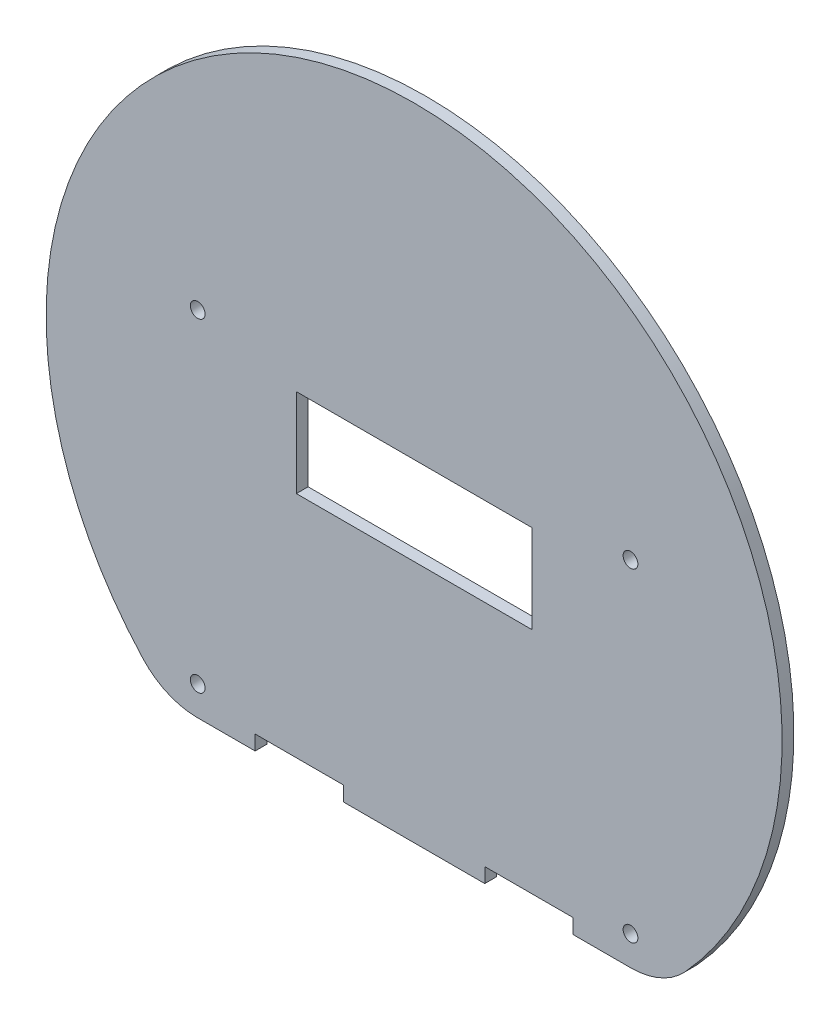
ISO-10303-21;
HEADER;
FILE_DESCRIPTION(('STEP AP214'),'2;1');
FILE_NAME('part.step','',(''),(''),'','','');
FILE_SCHEMA(('AUTOMOTIVE_DESIGN { 1 0 10303 214 1 1 1 1 }'));
ENDSEC;
DATA;
#1=APPLICATION_CONTEXT('core data for automotive mechanical design processes');
#2=APPLICATION_PROTOCOL_DEFINITION('international standard','automotive_design',2000,#1);
#3=PRODUCT_CONTEXT('',#1,'mechanical');
#4=PRODUCT('Part','Part','',(#3));
#5=PRODUCT_RELATED_PRODUCT_CATEGORY('part','',(#4));
#6=PRODUCT_DEFINITION_FORMATION('','',#4);
#7=PRODUCT_DEFINITION_CONTEXT('part definition',#1,'design');
#8=PRODUCT_DEFINITION('design','',#6,#7);
#9=PRODUCT_DEFINITION_SHAPE('','',#8);
#10=(LENGTH_UNIT() NAMED_UNIT(*) SI_UNIT(.MILLI.,.METRE.));
#11=(NAMED_UNIT(*) PLANE_ANGLE_UNIT() SI_UNIT($,.RADIAN.));
#12=(NAMED_UNIT(*) SI_UNIT($,.STERADIAN.) SOLID_ANGLE_UNIT());
#13=UNCERTAINTY_MEASURE_WITH_UNIT(LENGTH_MEASURE(1.E-05),#10,'distance_accuracy_value','');
#14=(GEOMETRIC_REPRESENTATION_CONTEXT(3) GLOBAL_UNCERTAINTY_ASSIGNED_CONTEXT((#13)) GLOBAL_UNIT_ASSIGNED_CONTEXT((#10,
#11,#12)) REPRESENTATION_CONTEXT('',''));
#15=CARTESIAN_POINT('',(0.,0.,0.));
#16=DIRECTION('',(0.,0.,1.));
#17=DIRECTION('',(1.,0.,0.));
#18=AXIS2_PLACEMENT_3D('',#15,#16,#17);
#19=CARTESIAN_POINT('',(-83.9155376460855,-92.6454669240131,-6.));
#20=DIRECTION('',(0.,1.,0.));
#21=DIRECTION('',(0.,0.,1.));
#22=AXIS2_PLACEMENT_3D('',#19,#20,#21);
#23=PLANE('',#22);
#24=DIRECTION('',(-1.,0.,0.));
#25=VECTOR('',#24,1.);
#26=CARTESIAN_POINT('',(0.,-92.6454669240131,0.));
#27=LINE('',#26,#25);
#28=CARTESIAN_POINT('',(24.,-92.6454669240131,0.));
#29=VERTEX_POINT('',#28);
#30=CARTESIAN_POINT('',(-24.,-92.6454669240131,0.));
#31=VERTEX_POINT('',#30);
#32=EDGE_CURVE('E257',#29,#31,#27,.T.);
#33=ORIENTED_EDGE('',*,*,#32,.F.);
#34=DIRECTION('',(0.,0.,1.));
#35=VECTOR('',#34,1.);
#36=CARTESIAN_POINT('',(24.,-92.6454669240131,-6.));
#37=LINE('',#36,#35);
#38=CARTESIAN_POINT('',(24.,-92.6454669240131,4.));
#39=VERTEX_POINT('',#38);
#40=EDGE_CURVE('E286',#29,#39,#37,.T.);
#41=ORIENTED_EDGE('',*,*,#40,.T.);
#42=DIRECTION('',(-1.,0.,0.));
#43=VECTOR('',#42,1.);
#44=CARTESIAN_POINT('',(-83.9155376460855,-92.6454669240131,4.));
#45=LINE('',#44,#43);
#46=CARTESIAN_POINT('',(-24.,-92.6454669240131,4.));
#47=VERTEX_POINT('',#46);
#48=EDGE_CURVE('E246',#39,#47,#45,.T.);
#49=ORIENTED_EDGE('',*,*,#48,.T.);
#50=DIRECTION('',(0.,0.,-1.));
#51=VECTOR('',#50,1.);
#52=CARTESIAN_POINT('',(-24.,-92.6454669240131,-6.));
#53=LINE('',#52,#51);
#54=EDGE_CURVE('E277',#47,#31,#53,.T.);
#55=ORIENTED_EDGE('',*,*,#54,.T.);
#56=EDGE_LOOP('',(#33,#41,#49,#55));
#57=FACE_BOUND('',#56,.T.);
#58=ADVANCED_FACE('F32',(#57),#23,.F.);
#59=CARTESIAN_POINT('',(-54.,-92.6454669240131,0.));
#60=VERTEX_POINT('',#59);
#61=CARTESIAN_POINT('',(-73.6484270343382,-92.6454669240131,0.));
#62=VERTEX_POINT('',#61);
#63=EDGE_CURVE('E250',#60,#62,#27,.T.);
#64=ORIENTED_EDGE('',*,*,#63,.F.);
#65=DIRECTION('',(0.,0.,1.));
#66=VECTOR('',#65,1.);
#67=CARTESIAN_POINT('',(-54.,-92.6454669240131,-6.));
#68=LINE('',#67,#66);
#69=CARTESIAN_POINT('',(-54.,-92.6454669240131,4.));
#70=VERTEX_POINT('',#69);
#71=EDGE_CURVE('E280',#60,#70,#68,.T.);
#72=ORIENTED_EDGE('',*,*,#71,.T.);
#73=CARTESIAN_POINT('',(-73.6484270343382,-92.6454669240131,4.));
#74=VERTEX_POINT('',#73);
#75=EDGE_CURVE('E241',#70,#74,#45,.T.);
#76=ORIENTED_EDGE('',*,*,#75,.T.);
#77=DIRECTION('',(0.,0.,-1.));
#78=VECTOR('',#77,1.);
#79=CARTESIAN_POINT('',(-73.6484270343382,-92.6454669240131,-6.));
#80=LINE('',#79,#78);
#81=EDGE_CURVE('E270',#74,#62,#80,.T.);
#82=ORIENTED_EDGE('',*,*,#81,.T.);
#83=EDGE_LOOP('',(#64,#72,#76,#82));
#84=FACE_BOUND('',#83,.T.);
#85=ADVANCED_FACE('F310',(#84),#23,.F.);
#86=CARTESIAN_POINT('',(0.,0.,4.));
#87=DIRECTION('',(0.,0.,-1.));
#88=DIRECTION('',(-1.,0.,0.));
#89=AXIS2_PLACEMENT_3D('',#86,#87,#88);
#90=CYLINDRICAL_SURFACE('',#89,125.);
#91=CARTESIAN_POINT('',(0.,0.,0.));
#92=DIRECTION('',(0.,0.,1.));
#93=DIRECTION('',(1.,0.,0.));
#94=AXIS2_PLACEMENT_3D('',#91,#92,#93);
#95=CIRCLE('',#94,125.);
#96=CARTESIAN_POINT('',(92.0605337929229,-84.5568336550164,0.));
#97=VERTEX_POINT('',#96);
#98=CARTESIAN_POINT('',(-92.0605337929228,-84.5568336550164,0.));
#99=VERTEX_POINT('',#98);
#100=EDGE_CURVE('E245',#97,#99,#95,.T.);
#101=ORIENTED_EDGE('',*,*,#100,.T.);
#102=DIRECTION('',(0.,0.,-1.));
#103=VECTOR('',#102,1.);
#104=CARTESIAN_POINT('',(-92.0605337929228,-84.5568336550164,4.));
#105=LINE('',#104,#103);
#106=CARTESIAN_POINT('',(-92.0605337929228,-84.5568336550164,4.));
#107=VERTEX_POINT('',#106);
#108=EDGE_CURVE('E259',#99,#107,#105,.F.);
#109=ORIENTED_EDGE('',*,*,#108,.T.);
#110=CARTESIAN_POINT('',(0.,0.,4.));
#111=DIRECTION('',(0.,0.,1.));
#112=DIRECTION('',(1.,0.,0.));
#113=AXIS2_PLACEMENT_3D('',#110,#111,#112);
#114=CIRCLE('',#113,125.);
#115=CARTESIAN_POINT('',(92.0605337929229,-84.5568336550164,4.));
#116=VERTEX_POINT('',#115);
#117=EDGE_CURVE('E247',#116,#107,#114,.T.);
#118=ORIENTED_EDGE('',*,*,#117,.F.);
#119=DIRECTION('',(0.,0.,-1.));
#120=VECTOR('',#119,1.);
#121=CARTESIAN_POINT('',(92.0605337929229,-84.5568336550164,4.));
#122=LINE('',#121,#120);
#123=EDGE_CURVE('E256',#116,#97,#122,.T.);
#124=ORIENTED_EDGE('',*,*,#123,.T.);
#125=EDGE_LOOP('',(#101,#109,#118,#124));
#126=FACE_BOUND('',#125,.T.);
#127=ADVANCED_FACE('F335',(#126),#90,.T.);
#128=CARTESIAN_POINT('',(0.,0.,4.));
#129=DIRECTION('',(0.,0.,1.));
#130=DIRECTION('',(1.,0.,0.));
#131=AXIS2_PLACEMENT_3D('',#128,#129,#130);
#132=PLANE('',#131);
#133=DIRECTION('',(0.,1.,0.));
#134=VECTOR('',#133,1.);
#135=CARTESIAN_POINT('',(40.,20.0744774174086,4.));
#136=LINE('',#135,#134);
#137=CARTESIAN_POINT('',(40.,-9.92552258259138,4.));
#138=VERTEX_POINT('',#137);
#139=CARTESIAN_POINT('',(40.,20.0744774174086,4.));
#140=VERTEX_POINT('',#139);
#141=EDGE_CURVE('E47',#138,#140,#136,.T.);
#142=ORIENTED_EDGE('',*,*,#141,.F.);
#143=DIRECTION('',(1.,0.,0.));
#144=VECTOR('',#143,1.);
#145=CARTESIAN_POINT('',(-40.,-9.92552258259138,4.));
#146=LINE('',#145,#144);
#147=CARTESIAN_POINT('',(-40.,-9.92552258259138,4.));
#148=VERTEX_POINT('',#147);
#149=EDGE_CURVE('E163',#148,#138,#146,.T.);
#150=ORIENTED_EDGE('',*,*,#149,.F.);
#151=DIRECTION('',(0.,-1.,0.));
#152=VECTOR('',#151,1.);
#153=CARTESIAN_POINT('',(-40.,20.0744774174086,4.));
#154=LINE('',#153,#152);
#155=CARTESIAN_POINT('',(-40.,20.0744774174086,4.));
#156=VERTEX_POINT('',#155);
#157=EDGE_CURVE('E166',#156,#148,#154,.T.);
#158=ORIENTED_EDGE('',*,*,#157,.F.);
#159=DIRECTION('',(-1.,0.,0.));
#160=VECTOR('',#159,1.);
#161=CARTESIAN_POINT('',(-40.,20.0744774174086,4.));
#162=LINE('',#161,#160);
#163=EDGE_CURVE('E172',#140,#156,#162,.T.);
#164=ORIENTED_EDGE('',*,*,#163,.F.);
#165=EDGE_LOOP('',(#142,#150,#158,#164));
#166=FACE_BOUND('',#165,.T.);
#167=CARTESIAN_POINT('',(-73.5,-82.6454669240131,4.));
#168=DIRECTION('',(0.,0.,1.));
#169=DIRECTION('',(1.,0.,0.));
#170=AXIS2_PLACEMENT_3D('',#167,#168,#169);
#171=CIRCLE('',#170,2.5);
#172=CARTESIAN_POINT('',(-71.,-82.6454669240131,4.));
#173=VERTEX_POINT('',#172);
#174=EDGE_CURVE('E178',#173,#173,#171,.T.);
#175=ORIENTED_EDGE('',*,*,#174,.F.);
#176=EDGE_LOOP('',(#175));
#177=FACE_BOUND('',#176,.T.);
#178=CARTESIAN_POINT('',(-73.5,27.3545330759869,4.));
#179=DIRECTION('',(0.,0.,1.));
#180=DIRECTION('',(1.,0.,0.));
#181=AXIS2_PLACEMENT_3D('',#178,#179,#180);
#182=CIRCLE('',#181,2.50000000000001);
#183=CARTESIAN_POINT('',(-71.,27.3545330759869,4.));
#184=VERTEX_POINT('',#183);
#185=EDGE_CURVE('E192',#184,#184,#182,.T.);
#186=ORIENTED_EDGE('',*,*,#185,.F.);
#187=EDGE_LOOP('',(#186));
#188=FACE_BOUND('',#187,.T.);
#189=CARTESIAN_POINT('',(73.5000000000001,27.3545330759869,4.));
#190=DIRECTION('',(0.,0.,1.));
#191=DIRECTION('',(1.,0.,0.));
#192=AXIS2_PLACEMENT_3D('',#189,#190,#191);
#193=CIRCLE('',#192,2.5);
#194=CARTESIAN_POINT('',(76.0000000000001,27.3545330759869,4.));
#195=VERTEX_POINT('',#194);
#196=EDGE_CURVE('E186',#195,#195,#193,.T.);
#197=ORIENTED_EDGE('',*,*,#196,.F.);
#198=EDGE_LOOP('',(#197));
#199=FACE_BOUND('',#198,.T.);
#200=CARTESIAN_POINT('',(73.5000000000001,-82.6454669240131,4.));
#201=DIRECTION('',(0.,0.,1.));
#202=DIRECTION('',(1.,0.,0.));
#203=AXIS2_PLACEMENT_3D('',#200,#201,#202);
#204=CIRCLE('',#203,2.50000000000001);
#205=CARTESIAN_POINT('',(76.0000000000001,-82.6454669240131,4.));
#206=VERTEX_POINT('',#205);
#207=EDGE_CURVE('E185',#206,#206,#204,.T.);
#208=ORIENTED_EDGE('',*,*,#207,.F.);
#209=EDGE_LOOP('',(#208));
#210=FACE_BOUND('',#209,.T.);
#211=DIRECTION('',(0.,-1.,0.));
#212=VECTOR('',#211,1.);
#213=CARTESIAN_POINT('',(24.,-92.6454669240131,4.));
#214=LINE('',#213,#212);
#215=CARTESIAN_POINT('',(24.,-87.6454669240131,4.));
#216=VERTEX_POINT('',#215);
#217=EDGE_CURVE('E206',#216,#39,#214,.T.);
#218=ORIENTED_EDGE('',*,*,#217,.F.);
#219=DIRECTION('',(-1.,0.,0.));
#220=VECTOR('',#219,1.);
#221=CARTESIAN_POINT('',(24.,-87.6454669240131,4.));
#222=LINE('',#221,#220);
#223=CARTESIAN_POINT('',(54.,-87.6454669240131,4.));
#224=VERTEX_POINT('',#223);
#225=EDGE_CURVE('E212',#224,#216,#222,.T.);
#226=ORIENTED_EDGE('',*,*,#225,.F.);
#227=DIRECTION('',(0.,1.,0.));
#228=VECTOR('',#227,1.);
#229=CARTESIAN_POINT('',(54.,-92.6454669240131,4.));
#230=LINE('',#229,#228);
#231=CARTESIAN_POINT('',(54.,-92.6454669240131,4.));
#232=VERTEX_POINT('',#231);
#233=EDGE_CURVE('E208',#232,#224,#230,.T.);
#234=ORIENTED_EDGE('',*,*,#233,.F.);
#235=CARTESIAN_POINT('',(73.6484270343383,-92.6454669240131,4.));
#236=VERTEX_POINT('',#235);
#237=EDGE_CURVE('E242',#236,#232,#45,.T.);
#238=ORIENTED_EDGE('',*,*,#237,.F.);
#239=CARTESIAN_POINT('',(73.6484270343383,-67.6454669240131,4.));
#240=DIRECTION('',(0.,0.,1.));
#241=DIRECTION('',(1.,0.,0.));
#242=AXIS2_PLACEMENT_3D('',#239,#240,#241);
#243=CIRCLE('',#242,25.);
#244=EDGE_CURVE('E262',#236,#116,#243,.T.);
#245=ORIENTED_EDGE('',*,*,#244,.T.);
#246=ORIENTED_EDGE('',*,*,#117,.T.);
#247=CARTESIAN_POINT('',(-73.6484270343382,-67.6454669240131,4.));
#248=DIRECTION('',(0.,0.,1.));
#249=DIRECTION('',(1.,0.,0.));
#250=AXIS2_PLACEMENT_3D('',#247,#248,#249);
#251=CIRCLE('',#250,25.);
#252=EDGE_CURVE('E264',#107,#74,#251,.T.);
#253=ORIENTED_EDGE('',*,*,#252,.T.);
#254=ORIENTED_EDGE('',*,*,#75,.F.);
#255=DIRECTION('',(0.,-1.,0.));
#256=VECTOR('',#255,1.);
#257=CARTESIAN_POINT('',(-54.,-92.6454669240131,4.));
#258=LINE('',#257,#256);
#259=CARTESIAN_POINT('',(-54.,-87.6454669240132,4.));
#260=VERTEX_POINT('',#259);
#261=EDGE_CURVE('E225',#260,#70,#258,.T.);
#262=ORIENTED_EDGE('',*,*,#261,.F.);
#263=DIRECTION('',(-1.,0.,0.));
#264=VECTOR('',#263,1.);
#265=CARTESIAN_POINT('',(-24.,-87.6454669240132,4.));
#266=LINE('',#265,#264);
#267=CARTESIAN_POINT('',(-24.,-87.6454669240132,4.));
#268=VERTEX_POINT('',#267);
#269=EDGE_CURVE('E222',#268,#260,#266,.T.);
#270=ORIENTED_EDGE('',*,*,#269,.F.);
#271=DIRECTION('',(0.,1.,0.));
#272=VECTOR('',#271,1.);
#273=CARTESIAN_POINT('',(-24.,-92.6454669240131,4.));
#274=LINE('',#273,#272);
#275=EDGE_CURVE('E203',#47,#268,#274,.T.);
#276=ORIENTED_EDGE('',*,*,#275,.F.);
#277=ORIENTED_EDGE('',*,*,#48,.F.);
#278=EDGE_LOOP('',(#218,#226,#234,#238,#245,#246,#253,#254,#262,#270,#276,#277));
#279=FACE_BOUND('',#278,.T.);
#280=ADVANCED_FACE('F305',(#166,#177,#188,#199,#210,#279),#132,.T.);
#281=CARTESIAN_POINT('',(0.,0.,0.));
#282=DIRECTION('',(0.,0.,1.));
#283=DIRECTION('',(1.,0.,0.));
#284=AXIS2_PLACEMENT_3D('',#281,#282,#283);
#285=PLANE('',#284);
#286=DIRECTION('',(1.,0.,0.));
#287=VECTOR('',#286,1.);
#288=CARTESIAN_POINT('',(-40.,-9.92552258259138,0.));
#289=LINE('',#288,#287);
#290=CARTESIAN_POINT('',(-40.,-9.92552258259138,0.));
#291=VERTEX_POINT('',#290);
#292=CARTESIAN_POINT('',(40.,-9.92552258259138,0.));
#293=VERTEX_POINT('',#292);
#294=EDGE_CURVE('E153',#291,#293,#289,.T.);
#295=ORIENTED_EDGE('',*,*,#294,.T.);
#296=DIRECTION('',(0.,1.,0.));
#297=VECTOR('',#296,1.);
#298=CARTESIAN_POINT('',(40.,20.0744774174086,0.));
#299=LINE('',#298,#297);
#300=CARTESIAN_POINT('',(40.,20.0744774174086,0.));
#301=VERTEX_POINT('',#300);
#302=EDGE_CURVE('E147',#293,#301,#299,.T.);
#303=ORIENTED_EDGE('',*,*,#302,.T.);
#304=DIRECTION('',(-1.,0.,0.));
#305=VECTOR('',#304,1.);
#306=CARTESIAN_POINT('',(-40.,20.0744774174086,0.));
#307=LINE('',#306,#305);
#308=CARTESIAN_POINT('',(-40.,20.0744774174086,0.));
#309=VERTEX_POINT('',#308);
#310=EDGE_CURVE('E156',#301,#309,#307,.T.);
#311=ORIENTED_EDGE('',*,*,#310,.T.);
#312=DIRECTION('',(0.,-1.,0.));
#313=VECTOR('',#312,1.);
#314=CARTESIAN_POINT('',(-40.,20.0744774174086,0.));
#315=LINE('',#314,#313);
#316=EDGE_CURVE('E55',#309,#291,#315,.T.);
#317=ORIENTED_EDGE('',*,*,#316,.T.);
#318=EDGE_LOOP('',(#295,#303,#311,#317));
#319=FACE_BOUND('',#318,.T.);
#320=CARTESIAN_POINT('',(-73.5,-82.6454669240131,0.));
#321=DIRECTION('',(0.,0.,1.));
#322=DIRECTION('',(1.,0.,0.));
#323=AXIS2_PLACEMENT_3D('',#320,#321,#322);
#324=CIRCLE('',#323,2.5);
#325=CARTESIAN_POINT('',(-71.,-82.6454669240131,0.));
#326=VERTEX_POINT('',#325);
#327=EDGE_CURVE('E195',#326,#326,#324,.T.);
#328=ORIENTED_EDGE('',*,*,#327,.T.);
#329=EDGE_LOOP('',(#328));
#330=FACE_BOUND('',#329,.T.);
#331=CARTESIAN_POINT('',(-73.5,27.3545330759869,0.));
#332=DIRECTION('',(0.,0.,1.));
#333=DIRECTION('',(1.,0.,0.));
#334=AXIS2_PLACEMENT_3D('',#331,#332,#333);
#335=CIRCLE('',#334,2.50000000000001);
#336=CARTESIAN_POINT('',(-71.,27.3545330759869,0.));
#337=VERTEX_POINT('',#336);
#338=EDGE_CURVE('E189',#337,#337,#335,.T.);
#339=ORIENTED_EDGE('',*,*,#338,.T.);
#340=EDGE_LOOP('',(#339));
#341=FACE_BOUND('',#340,.T.);
#342=CARTESIAN_POINT('',(73.5000000000001,27.3545330759869,0.));
#343=DIRECTION('',(0.,0.,1.));
#344=DIRECTION('',(1.,0.,0.));
#345=AXIS2_PLACEMENT_3D('',#342,#343,#344);
#346=CIRCLE('',#345,2.5);
#347=CARTESIAN_POINT('',(76.0000000000001,27.3545330759869,0.));
#348=VERTEX_POINT('',#347);
#349=EDGE_CURVE('E182',#348,#348,#346,.T.);
#350=ORIENTED_EDGE('',*,*,#349,.T.);
#351=EDGE_LOOP('',(#350));
#352=FACE_BOUND('',#351,.T.);
#353=CARTESIAN_POINT('',(73.5000000000001,-82.6454669240131,0.));
#354=DIRECTION('',(0.,0.,1.));
#355=DIRECTION('',(1.,0.,0.));
#356=AXIS2_PLACEMENT_3D('',#353,#354,#355);
#357=CIRCLE('',#356,2.50000000000001);
#358=CARTESIAN_POINT('',(76.0000000000001,-82.6454669240131,0.));
#359=VERTEX_POINT('',#358);
#360=EDGE_CURVE('E200',#359,#359,#357,.T.);
#361=ORIENTED_EDGE('',*,*,#360,.T.);
#362=EDGE_LOOP('',(#361));
#363=FACE_BOUND('',#362,.T.);
#364=DIRECTION('',(-1.,0.,0.));
#365=VECTOR('',#364,1.);
#366=CARTESIAN_POINT('',(0.,-87.6454669240131,0.));
#367=LINE('',#366,#365);
#368=CARTESIAN_POINT('',(54.,-87.6454669240131,0.));
#369=VERTEX_POINT('',#368);
#370=CARTESIAN_POINT('',(24.,-87.6454669240131,0.));
#371=VERTEX_POINT('',#370);
#372=EDGE_CURVE('E11',#369,#371,#367,.T.);
#373=ORIENTED_EDGE('',*,*,#372,.T.);
#374=DIRECTION('',(0.,-1.,0.));
#375=VECTOR('',#374,1.);
#376=CARTESIAN_POINT('',(24.,0.,0.));
#377=LINE('',#376,#375);
#378=EDGE_CURVE('E238',#371,#29,#377,.T.);
#379=ORIENTED_EDGE('',*,*,#378,.T.);
#380=ORIENTED_EDGE('',*,*,#32,.T.);
#381=DIRECTION('',(0.,1.,0.));
#382=VECTOR('',#381,1.);
#383=CARTESIAN_POINT('',(-24.,0.,0.));
#384=LINE('',#383,#382);
#385=CARTESIAN_POINT('',(-24.,-87.6454669240132,0.));
#386=VERTEX_POINT('',#385);
#387=EDGE_CURVE('E218',#31,#386,#384,.T.);
#388=ORIENTED_EDGE('',*,*,#387,.T.);
#389=DIRECTION('',(-1.,0.,0.));
#390=VECTOR('',#389,1.);
#391=CARTESIAN_POINT('',(0.,-87.6454669240132,0.));
#392=LINE('',#391,#390);
#393=CARTESIAN_POINT('',(-54.,-87.6454669240132,0.));
#394=VERTEX_POINT('',#393);
#395=EDGE_CURVE('E40',#386,#394,#392,.T.);
#396=ORIENTED_EDGE('',*,*,#395,.T.);
#397=DIRECTION('',(0.,-1.,0.));
#398=VECTOR('',#397,1.);
#399=CARTESIAN_POINT('',(-54.,0.,0.));
#400=LINE('',#399,#398);
#401=EDGE_CURVE('E232',#394,#60,#400,.T.);
#402=ORIENTED_EDGE('',*,*,#401,.T.);
#403=ORIENTED_EDGE('',*,*,#63,.T.);
#404=CARTESIAN_POINT('',(-73.6484270343382,-67.6454669240131,0.));
#405=DIRECTION('',(0.,0.,1.));
#406=DIRECTION('',(1.,0.,0.));
#407=AXIS2_PLACEMENT_3D('',#404,#405,#406);
#408=CIRCLE('',#407,25.);
#409=EDGE_CURVE('E275',#62,#99,#408,.F.);
#410=ORIENTED_EDGE('',*,*,#409,.T.);
#411=ORIENTED_EDGE('',*,*,#100,.F.);
#412=CARTESIAN_POINT('',(73.6484270343383,-67.6454669240131,0.));
#413=DIRECTION('',(0.,0.,1.));
#414=DIRECTION('',(1.,0.,0.));
#415=AXIS2_PLACEMENT_3D('',#412,#413,#414);
#416=CIRCLE('',#415,25.);
#417=CARTESIAN_POINT('',(73.6484270343383,-92.6454669240131,0.));
#418=VERTEX_POINT('',#417);
#419=EDGE_CURVE('E273',#97,#418,#416,.F.);
#420=ORIENTED_EDGE('',*,*,#419,.T.);
#421=CARTESIAN_POINT('',(54.,-92.6454669240131,0.));
#422=VERTEX_POINT('',#421);
#423=EDGE_CURVE('E253',#418,#422,#27,.T.);
#424=ORIENTED_EDGE('',*,*,#423,.T.);
#425=DIRECTION('',(0.,1.,0.));
#426=VECTOR('',#425,1.);
#427=CARTESIAN_POINT('',(54.,0.,0.));
#428=LINE('',#427,#426);
#429=EDGE_CURVE('E235',#422,#369,#428,.T.);
#430=ORIENTED_EDGE('',*,*,#429,.T.);
#431=EDGE_LOOP('',(#373,#379,#380,#388,#396,#402,#403,#410,#411,#420,#424,#430));
#432=FACE_BOUND('',#431,.T.);
#433=ADVANCED_FACE('F160',(#319,#330,#341,#352,#363,#432),#285,.F.);
#434=ORIENTED_EDGE('',*,*,#237,.T.);
#435=DIRECTION('',(0.,0.,-1.));
#436=VECTOR('',#435,1.);
#437=CARTESIAN_POINT('',(54.,-92.6454669240131,-6.));
#438=LINE('',#437,#436);
#439=EDGE_CURVE('E283',#232,#422,#438,.T.);
#440=ORIENTED_EDGE('',*,*,#439,.T.);
#441=ORIENTED_EDGE('',*,*,#423,.F.);
#442=DIRECTION('',(0.,0.,-1.));
#443=VECTOR('',#442,1.);
#444=CARTESIAN_POINT('',(73.6484270343383,-92.6454669240131,-6.));
#445=LINE('',#444,#443);
#446=EDGE_CURVE('E267',#418,#236,#445,.F.);
#447=ORIENTED_EDGE('',*,*,#446,.T.);
#448=EDGE_LOOP('',(#434,#440,#441,#447));
#449=FACE_BOUND('',#448,.T.);
#450=ADVANCED_FACE('F327',(#449),#23,.F.);
#451=CARTESIAN_POINT('',(-73.6484270343382,-67.6454669240131,4.));
#452=DIRECTION('',(0.,0.,-1.));
#453=DIRECTION('',(-1.,0.,0.));
#454=AXIS2_PLACEMENT_3D('',#451,#452,#453);
#455=CYLINDRICAL_SURFACE('',#454,25.);
#456=ORIENTED_EDGE('',*,*,#409,.F.);
#457=ORIENTED_EDGE('',*,*,#81,.F.);
#458=ORIENTED_EDGE('',*,*,#252,.F.);
#459=ORIENTED_EDGE('',*,*,#108,.F.);
#460=EDGE_LOOP('',(#456,#457,#458,#459));
#461=FACE_BOUND('',#460,.T.);
#462=ADVANCED_FACE('F339',(#461),#455,.T.);
#463=CARTESIAN_POINT('',(73.6484270343383,-67.6454669240131,4.));
#464=DIRECTION('',(0.,0.,-1.));
#465=DIRECTION('',(-1.,0.,0.));
#466=AXIS2_PLACEMENT_3D('',#463,#464,#465);
#467=CYLINDRICAL_SURFACE('',#466,25.);
#468=ORIENTED_EDGE('',*,*,#419,.F.);
#469=ORIENTED_EDGE('',*,*,#123,.F.);
#470=ORIENTED_EDGE('',*,*,#244,.F.);
#471=ORIENTED_EDGE('',*,*,#446,.F.);
#472=EDGE_LOOP('',(#468,#469,#470,#471));
#473=FACE_BOUND('',#472,.T.);
#474=ADVANCED_FACE('F34',(#473),#467,.T.);
#475=CARTESIAN_POINT('',(-24.,-87.6454669240132,-1.));
#476=DIRECTION('',(0.,1.,0.));
#477=DIRECTION('',(0.,0.,1.));
#478=AXIS2_PLACEMENT_3D('',#475,#476,#477);
#479=PLANE('',#478);
#480=DIRECTION('',(0.,0.,1.));
#481=VECTOR('',#480,1.);
#482=CARTESIAN_POINT('',(-24.,-87.6454669240132,-1.));
#483=LINE('',#482,#481);
#484=EDGE_CURVE('E227',#386,#268,#483,.T.);
#485=ORIENTED_EDGE('',*,*,#484,.T.);
#486=ORIENTED_EDGE('',*,*,#269,.T.);
#487=DIRECTION('',(0.,0.,1.));
#488=VECTOR('',#487,1.);
#489=CARTESIAN_POINT('',(-54.,-87.6454669240132,-1.));
#490=LINE('',#489,#488);
#491=EDGE_CURVE('E209',#394,#260,#490,.T.);
#492=ORIENTED_EDGE('',*,*,#491,.F.);
#493=ORIENTED_EDGE('',*,*,#395,.F.);
#494=EDGE_LOOP('',(#485,#486,#492,#493));
#495=FACE_BOUND('',#494,.T.);
#496=ADVANCED_FACE('F295',(#495),#479,.F.);
#497=CARTESIAN_POINT('',(-54.,-92.6454669240131,-1.));
#498=DIRECTION('',(-1.,0.,0.));
#499=DIRECTION('',(0.,0.,1.));
#500=AXIS2_PLACEMENT_3D('',#497,#498,#499);
#501=PLANE('',#500);
#502=ORIENTED_EDGE('',*,*,#491,.T.);
#503=ORIENTED_EDGE('',*,*,#261,.T.);
#504=ORIENTED_EDGE('',*,*,#71,.F.);
#505=ORIENTED_EDGE('',*,*,#401,.F.);
#506=EDGE_LOOP('',(#502,#503,#504,#505));
#507=FACE_BOUND('',#506,.T.);
#508=ADVANCED_FACE('F308',(#507),#501,.F.);
#509=CARTESIAN_POINT('',(-24.,-92.6454669240131,-1.));
#510=DIRECTION('',(1.,0.,0.));
#511=DIRECTION('',(0.,0.,-1.));
#512=AXIS2_PLACEMENT_3D('',#509,#510,#511);
#513=PLANE('',#512);
#514=ORIENTED_EDGE('',*,*,#54,.F.);
#515=ORIENTED_EDGE('',*,*,#275,.T.);
#516=ORIENTED_EDGE('',*,*,#484,.F.);
#517=ORIENTED_EDGE('',*,*,#387,.F.);
#518=EDGE_LOOP('',(#514,#515,#516,#517));
#519=FACE_BOUND('',#518,.T.);
#520=ADVANCED_FACE('F297',(#519),#513,.F.);
#521=CARTESIAN_POINT('',(24.,-87.6454669240131,-1.));
#522=DIRECTION('',(0.,1.,0.));
#523=DIRECTION('',(0.,0.,1.));
#524=AXIS2_PLACEMENT_3D('',#521,#522,#523);
#525=PLANE('',#524);
#526=DIRECTION('',(0.,0.,1.));
#527=VECTOR('',#526,1.);
#528=CARTESIAN_POINT('',(54.,-87.6454669240131,-1.));
#529=LINE('',#528,#527);
#530=EDGE_CURVE('E215',#369,#224,#529,.T.);
#531=ORIENTED_EDGE('',*,*,#530,.T.);
#532=ORIENTED_EDGE('',*,*,#225,.T.);
#533=DIRECTION('',(0.,0.,1.));
#534=VECTOR('',#533,1.);
#535=CARTESIAN_POINT('',(24.,-87.6454669240131,-1.));
#536=LINE('',#535,#534);
#537=EDGE_CURVE('E216',#371,#216,#536,.T.);
#538=ORIENTED_EDGE('',*,*,#537,.F.);
#539=ORIENTED_EDGE('',*,*,#372,.F.);
#540=EDGE_LOOP('',(#531,#532,#538,#539));
#541=FACE_BOUND('',#540,.T.);
#542=ADVANCED_FACE('F321',(#541),#525,.F.);
#543=CARTESIAN_POINT('',(24.,-92.6454669240131,-1.));
#544=DIRECTION('',(-1.,0.,0.));
#545=DIRECTION('',(0.,0.,1.));
#546=AXIS2_PLACEMENT_3D('',#543,#544,#545);
#547=PLANE('',#546);
#548=ORIENTED_EDGE('',*,*,#537,.T.);
#549=ORIENTED_EDGE('',*,*,#217,.T.);
#550=ORIENTED_EDGE('',*,*,#40,.F.);
#551=ORIENTED_EDGE('',*,*,#378,.F.);
#552=EDGE_LOOP('',(#548,#549,#550,#551));
#553=FACE_BOUND('',#552,.T.);
#554=ADVANCED_FACE('F318',(#553),#547,.F.);
#555=CARTESIAN_POINT('',(54.,-92.6454669240131,-1.));
#556=DIRECTION('',(1.,0.,0.));
#557=DIRECTION('',(0.,0.,-1.));
#558=AXIS2_PLACEMENT_3D('',#555,#556,#557);
#559=PLANE('',#558);
#560=ORIENTED_EDGE('',*,*,#439,.F.);
#561=ORIENTED_EDGE('',*,*,#233,.T.);
#562=ORIENTED_EDGE('',*,*,#530,.F.);
#563=ORIENTED_EDGE('',*,*,#429,.F.);
#564=EDGE_LOOP('',(#560,#561,#562,#563));
#565=FACE_BOUND('',#564,.T.);
#566=ADVANCED_FACE('F324',(#565),#559,.F.);
#567=CARTESIAN_POINT('',(73.5000000000001,-82.6454669240131,0.));
#568=DIRECTION('',(0.,0.,1.));
#569=DIRECTION('',(1.,0.,0.));
#570=AXIS2_PLACEMENT_3D('',#567,#568,#569);
#571=CYLINDRICAL_SURFACE('',#570,2.50000000000001);
#572=ORIENTED_EDGE('',*,*,#360,.F.);
#573=EDGE_LOOP('',(#572));
#574=FACE_BOUND('',#573,.T.);
#575=ORIENTED_EDGE('',*,*,#207,.T.);
#576=EDGE_LOOP('',(#575));
#577=FACE_BOUND('',#576,.T.);
#578=ADVANCED_FACE('F428',(#574,#577),#571,.F.);
#579=CARTESIAN_POINT('',(73.5000000000001,27.3545330759869,0.));
#580=DIRECTION('',(0.,0.,1.));
#581=DIRECTION('',(1.,0.,0.));
#582=AXIS2_PLACEMENT_3D('',#579,#580,#581);
#583=CYLINDRICAL_SURFACE('',#582,2.5);
#584=ORIENTED_EDGE('',*,*,#349,.F.);
#585=EDGE_LOOP('',(#584));
#586=FACE_BOUND('',#585,.T.);
#587=ORIENTED_EDGE('',*,*,#196,.T.);
#588=EDGE_LOOP('',(#587));
#589=FACE_BOUND('',#588,.T.);
#590=ADVANCED_FACE('F437',(#586,#589),#583,.F.);
#591=CARTESIAN_POINT('',(-73.5,27.3545330759869,0.));
#592=DIRECTION('',(0.,0.,1.));
#593=DIRECTION('',(1.,0.,0.));
#594=AXIS2_PLACEMENT_3D('',#591,#592,#593);
#595=CYLINDRICAL_SURFACE('',#594,2.50000000000001);
#596=ORIENTED_EDGE('',*,*,#338,.F.);
#597=EDGE_LOOP('',(#596));
#598=FACE_BOUND('',#597,.T.);
#599=ORIENTED_EDGE('',*,*,#185,.T.);
#600=EDGE_LOOP('',(#599));
#601=FACE_BOUND('',#600,.T.);
#602=ADVANCED_FACE('F447',(#598,#601),#595,.F.);
#603=CARTESIAN_POINT('',(-73.5,-82.6454669240131,0.));
#604=DIRECTION('',(0.,0.,1.));
#605=DIRECTION('',(1.,0.,0.));
#606=AXIS2_PLACEMENT_3D('',#603,#604,#605);
#607=CYLINDRICAL_SURFACE('',#606,2.5);
#608=ORIENTED_EDGE('',*,*,#327,.F.);
#609=EDGE_LOOP('',(#608));
#610=FACE_BOUND('',#609,.T.);
#611=ORIENTED_EDGE('',*,*,#174,.T.);
#612=EDGE_LOOP('',(#611));
#613=FACE_BOUND('',#612,.T.);
#614=ADVANCED_FACE('F456',(#610,#613),#607,.F.);
#615=CARTESIAN_POINT('',(40.,20.0744774174086,0.));
#616=DIRECTION('',(1.,0.,0.));
#617=DIRECTION('',(0.,1.,0.));
#618=AXIS2_PLACEMENT_3D('',#615,#616,#617);
#619=PLANE('',#618);
#620=ORIENTED_EDGE('',*,*,#141,.T.);
#621=DIRECTION('',(0.,0.,1.));
#622=VECTOR('',#621,1.);
#623=CARTESIAN_POINT('',(40.,20.0744774174086,0.));
#624=LINE('',#623,#622);
#625=EDGE_CURVE('E143',#301,#140,#624,.T.);
#626=ORIENTED_EDGE('',*,*,#625,.F.);
#627=ORIENTED_EDGE('',*,*,#302,.F.);
#628=DIRECTION('',(0.,0.,1.));
#629=VECTOR('',#628,1.);
#630=CARTESIAN_POINT('',(40.,-9.92552258259138,0.));
#631=LINE('',#630,#629);
#632=EDGE_CURVE('E176',#293,#138,#631,.T.);
#633=ORIENTED_EDGE('',*,*,#632,.T.);
#634=EDGE_LOOP('',(#620,#626,#627,#633));
#635=FACE_BOUND('',#634,.T.);
#636=ADVANCED_FACE('F145',(#635),#619,.F.);
#637=CARTESIAN_POINT('',(-40.,-9.92552258259138,0.));
#638=DIRECTION('',(0.,-1.,0.));
#639=DIRECTION('',(0.,0.,-1.));
#640=AXIS2_PLACEMENT_3D('',#637,#638,#639);
#641=PLANE('',#640);
#642=ORIENTED_EDGE('',*,*,#149,.T.);
#643=ORIENTED_EDGE('',*,*,#632,.F.);
#644=ORIENTED_EDGE('',*,*,#294,.F.);
#645=DIRECTION('',(0.,0.,1.));
#646=VECTOR('',#645,1.);
#647=CARTESIAN_POINT('',(-40.,-9.92552258259138,0.));
#648=LINE('',#647,#646);
#649=EDGE_CURVE('E179',#291,#148,#648,.T.);
#650=ORIENTED_EDGE('',*,*,#649,.T.);
#651=EDGE_LOOP('',(#642,#643,#644,#650));
#652=FACE_BOUND('',#651,.T.);
#653=ADVANCED_FACE('F474',(#652),#641,.F.);
#654=CARTESIAN_POINT('',(-40.,20.0744774174086,0.));
#655=DIRECTION('',(-1.,0.,0.));
#656=DIRECTION('',(0.,0.,1.));
#657=AXIS2_PLACEMENT_3D('',#654,#655,#656);
#658=PLANE('',#657);
#659=ORIENTED_EDGE('',*,*,#157,.T.);
#660=ORIENTED_EDGE('',*,*,#649,.F.);
#661=ORIENTED_EDGE('',*,*,#316,.F.);
#662=DIRECTION('',(0.,0.,1.));
#663=VECTOR('',#662,1.);
#664=CARTESIAN_POINT('',(-40.,20.0744774174086,0.));
#665=LINE('',#664,#663);
#666=EDGE_CURVE('E152',#309,#156,#665,.T.);
#667=ORIENTED_EDGE('',*,*,#666,.T.);
#668=EDGE_LOOP('',(#659,#660,#661,#667));
#669=FACE_BOUND('',#668,.T.);
#670=ADVANCED_FACE('F480',(#669),#658,.F.);
#671=CARTESIAN_POINT('',(-40.,20.0744774174086,0.));
#672=DIRECTION('',(0.,1.,0.));
#673=DIRECTION('',(0.,0.,1.));
#674=AXIS2_PLACEMENT_3D('',#671,#672,#673);
#675=PLANE('',#674);
#676=ORIENTED_EDGE('',*,*,#163,.T.);
#677=ORIENTED_EDGE('',*,*,#666,.F.);
#678=ORIENTED_EDGE('',*,*,#310,.F.);
#679=ORIENTED_EDGE('',*,*,#625,.T.);
#680=EDGE_LOOP('',(#676,#677,#678,#679));
#681=FACE_BOUND('',#680,.T.);
#682=ADVANCED_FACE('F157',(#681),#675,.F.);
#683=CLOSED_SHELL('',(#58,#85,#127,#280,#433,#450,#462,#474,#496,#508,#520,#542,#554,#566,#578,
#590,#602,#614,#636,#653,#670,#682));
#684=MANIFOLD_SOLID_BREP('B2',#683);
#685=ADVANCED_BREP_SHAPE_REPRESENTATION('',(#18,#684),#14);
#686=SHAPE_DEFINITION_REPRESENTATION(#9,#685);
ENDSEC;
END-ISO-10303-21;
